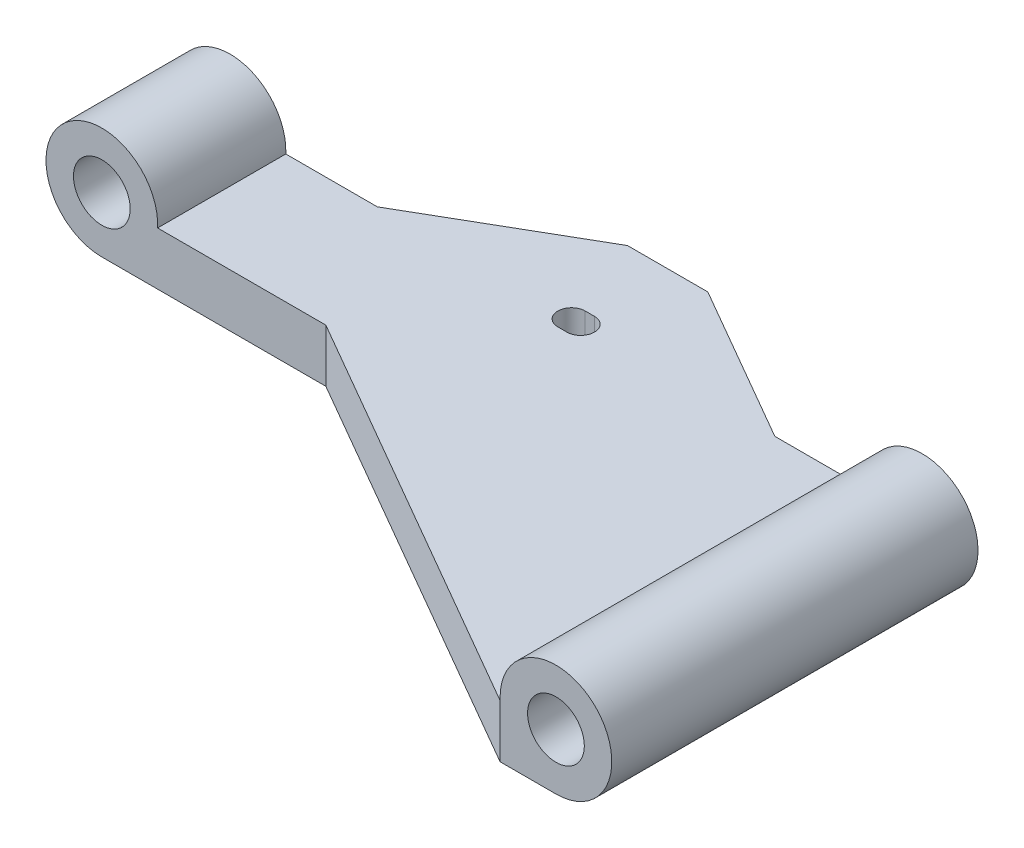
ISO-10303-21;
HEADER;
FILE_DESCRIPTION(('STEP AP214'),'2;1');
FILE_NAME('part.step','',(''),(''),'','','');
FILE_SCHEMA(('AUTOMOTIVE_DESIGN { 1 0 10303 214 1 1 1 1 }'));
ENDSEC;
DATA;
#1=APPLICATION_CONTEXT('core data for automotive mechanical design processes');
#2=APPLICATION_PROTOCOL_DEFINITION('international standard','automotive_design',2000,#1);
#3=PRODUCT_CONTEXT('',#1,'mechanical');
#4=PRODUCT('Part','Part','',(#3));
#5=PRODUCT_RELATED_PRODUCT_CATEGORY('part','',(#4));
#6=PRODUCT_DEFINITION_FORMATION('','',#4);
#7=PRODUCT_DEFINITION_CONTEXT('part definition',#1,'design');
#8=PRODUCT_DEFINITION('design','',#6,#7);
#9=PRODUCT_DEFINITION_SHAPE('','',#8);
#10=(LENGTH_UNIT() NAMED_UNIT(*) SI_UNIT(.MILLI.,.METRE.));
#11=(NAMED_UNIT(*) PLANE_ANGLE_UNIT() SI_UNIT($,.RADIAN.));
#12=(NAMED_UNIT(*) SI_UNIT($,.STERADIAN.) SOLID_ANGLE_UNIT());
#13=UNCERTAINTY_MEASURE_WITH_UNIT(LENGTH_MEASURE(1.E-05),#10,'distance_accuracy_value','');
#14=(GEOMETRIC_REPRESENTATION_CONTEXT(3) GLOBAL_UNCERTAINTY_ASSIGNED_CONTEXT((#13)) GLOBAL_UNIT_ASSIGNED_CONTEXT((#10,
#11,#12)) REPRESENTATION_CONTEXT('',''));
#15=CARTESIAN_POINT('',(0.,0.,0.));
#16=DIRECTION('',(0.,0.,1.));
#17=DIRECTION('',(1.,0.,0.));
#18=AXIS2_PLACEMENT_3D('',#15,#16,#17);
#19=CARTESIAN_POINT('',(-18.9,15.755,45.));
#20=DIRECTION('',(0.,0.,1.));
#21=DIRECTION('',(1.,0.,0.));
#22=AXIS2_PLACEMENT_3D('',#19,#20,#21);
#23=CYLINDRICAL_SURFACE('',#22,3.05000000000001);
#24=DIRECTION('',(0.,0.,1.));
#25=VECTOR('',#24,1.);
#26=CARTESIAN_POINT('',(-15.8539410708261,15.6,45.));
#27=LINE('',#26,#25);
#28=CARTESIAN_POINT('',(-15.8539410708261,15.6,50.));
#29=VERTEX_POINT('',#28);
#30=CARTESIAN_POINT('',(-15.8539410708261,15.6,57.));
#31=VERTEX_POINT('',#30);
#32=EDGE_CURVE('E48',#29,#31,#27,.T.);
#33=ORIENTED_EDGE('',*,*,#32,.F.);
#34=CARTESIAN_POINT('',(-18.9,15.755,50.));
#35=DIRECTION('',(0.,0.,-1.));
#36=DIRECTION('',(-1.,0.,0.));
#37=AXIS2_PLACEMENT_3D('',#34,#35,#36);
#38=CIRCLE('',#37,3.05000000000001);
#39=CARTESIAN_POINT('',(-18.9,12.705,50.));
#40=VERTEX_POINT('',#39);
#41=EDGE_CURVE('E210',#29,#40,#38,.F.);
#42=ORIENTED_EDGE('',*,*,#41,.T.);
#43=DIRECTION('',(0.,0.,1.));
#44=VECTOR('',#43,1.);
#45=CARTESIAN_POINT('',(-18.9,12.705,45.));
#46=LINE('',#45,#44);
#47=CARTESIAN_POINT('',(-18.9,12.705,57.));
#48=VERTEX_POINT('',#47);
#49=EDGE_CURVE('E251',#40,#48,#46,.T.);
#50=ORIENTED_EDGE('',*,*,#49,.T.);
#51=CARTESIAN_POINT('',(-18.9,15.755,57.));
#52=DIRECTION('',(0.,0.,-1.));
#53=DIRECTION('',(-1.,0.,0.));
#54=AXIS2_PLACEMENT_3D('',#51,#52,#53);
#55=CIRCLE('',#54,3.05000000000001);
#56=EDGE_CURVE('E161',#31,#48,#55,.F.);
#57=ORIENTED_EDGE('',*,*,#56,.F.);
#58=EDGE_LOOP('',(#33,#42,#50,#57));
#59=FACE_BOUND('',#58,.T.);
#60=ADVANCED_FACE('F39',(#59),#23,.T.);
#61=CARTESIAN_POINT('',(0.249999999999998,12.705,50.));
#62=DIRECTION('',(0.,1.,0.));
#63=DIRECTION('',(-1.,0.,0.));
#64=AXIS2_PLACEMENT_3D('',#61,#62,#63);
#65=CYLINDRICAL_SURFACE('',#64,0.750000000000001);
#66=CARTESIAN_POINT('',(0.249999999999998,13.505,50.));
#67=DIRECTION('',(0.,-1.,0.));
#68=DIRECTION('',(1.,0.,0.));
#69=AXIS2_PLACEMENT_3D('',#66,#67,#68);
#70=CIRCLE('',#69,0.750000000000001);
#71=CARTESIAN_POINT('',(0.249999999999998,13.505,50.75));
#72=VERTEX_POINT('',#71);
#73=CARTESIAN_POINT('',(0.249999999999998,13.505,49.25));
#74=VERTEX_POINT('',#73);
#75=EDGE_CURVE('E222',#72,#74,#70,.F.);
#76=ORIENTED_EDGE('',*,*,#75,.F.);
#77=DIRECTION('',(0.,1.,0.));
#78=VECTOR('',#77,1.);
#79=CARTESIAN_POINT('',(0.249999999999998,12.705,50.75));
#80=LINE('',#79,#78);
#81=CARTESIAN_POINT('',(0.249999999999998,15.6,50.75));
#82=VERTEX_POINT('',#81);
#83=EDGE_CURVE('E237',#72,#82,#80,.T.);
#84=ORIENTED_EDGE('',*,*,#83,.T.);
#85=CARTESIAN_POINT('',(0.249999999999998,15.6,50.));
#86=DIRECTION('',(0.,1.,0.));
#87=DIRECTION('',(-1.,0.,0.));
#88=AXIS2_PLACEMENT_3D('',#85,#86,#87);
#89=CIRCLE('',#88,0.750000000000001);
#90=CARTESIAN_POINT('',(0.249999999999998,15.6,49.25));
#91=VERTEX_POINT('',#90);
#92=EDGE_CURVE('E224',#82,#91,#89,.T.);
#93=ORIENTED_EDGE('',*,*,#92,.T.);
#94=DIRECTION('',(0.,1.,0.));
#95=VECTOR('',#94,1.);
#96=CARTESIAN_POINT('',(0.249999999999998,12.705,49.25));
#97=LINE('',#96,#95);
#98=EDGE_CURVE('E236',#74,#91,#97,.T.);
#99=ORIENTED_EDGE('',*,*,#98,.F.);
#100=EDGE_LOOP('',(#76,#84,#93,#99));
#101=FACE_BOUND('',#100,.T.);
#102=ADVANCED_FACE('F287',(#101),#65,.F.);
#103=CARTESIAN_POINT('',(0.249999999999998,12.705,50.75));
#104=DIRECTION('',(0.,0.,1.));
#105=DIRECTION('',(1.,0.,0.));
#106=AXIS2_PLACEMENT_3D('',#103,#104,#105);
#107=PLANE('',#106);
#108=DIRECTION('',(1.,0.,0.));
#109=VECTOR('',#108,1.);
#110=CARTESIAN_POINT('',(0.249999999999998,13.505,50.75));
#111=LINE('',#110,#109);
#112=CARTESIAN_POINT('',(-0.250000000000002,13.505,50.75));
#113=VERTEX_POINT('',#112);
#114=EDGE_CURVE('E220',#113,#72,#111,.T.);
#115=ORIENTED_EDGE('',*,*,#114,.F.);
#116=DIRECTION('',(0.,1.,0.));
#117=VECTOR('',#116,1.);
#118=CARTESIAN_POINT('',(-0.250000000000002,12.705,50.75));
#119=LINE('',#118,#117);
#120=CARTESIAN_POINT('',(-0.250000000000002,15.6,50.75));
#121=VERTEX_POINT('',#120);
#122=EDGE_CURVE('E239',#113,#121,#119,.T.);
#123=ORIENTED_EDGE('',*,*,#122,.T.);
#124=DIRECTION('',(1.,0.,0.));
#125=VECTOR('',#124,1.);
#126=CARTESIAN_POINT('',(0.249999999999998,15.6,50.75));
#127=LINE('',#126,#125);
#128=EDGE_CURVE('E233',#121,#82,#127,.T.);
#129=ORIENTED_EDGE('',*,*,#128,.T.);
#130=ORIENTED_EDGE('',*,*,#83,.F.);
#131=EDGE_LOOP('',(#115,#123,#129,#130));
#132=FACE_BOUND('',#131,.T.);
#133=ADVANCED_FACE('F292',(#132),#107,.F.);
#134=CARTESIAN_POINT('',(-0.250000000000002,12.705,50.));
#135=DIRECTION('',(0.,1.,0.));
#136=DIRECTION('',(-1.,0.,0.));
#137=AXIS2_PLACEMENT_3D('',#134,#135,#136);
#138=CYLINDRICAL_SURFACE('',#137,0.750000000000001);
#139=CARTESIAN_POINT('',(-0.250000000000002,13.505,50.));
#140=DIRECTION('',(0.,-1.,0.));
#141=DIRECTION('',(1.,0.,0.));
#142=AXIS2_PLACEMENT_3D('',#139,#140,#141);
#143=CIRCLE('',#142,0.750000000000001);
#144=CARTESIAN_POINT('',(-0.250000000000002,13.505,49.25));
#145=VERTEX_POINT('',#144);
#146=EDGE_CURVE('E216',#145,#113,#143,.F.);
#147=ORIENTED_EDGE('',*,*,#146,.F.);
#148=DIRECTION('',(0.,1.,0.));
#149=VECTOR('',#148,1.);
#150=CARTESIAN_POINT('',(-0.250000000000002,12.705,49.25));
#151=LINE('',#150,#149);
#152=CARTESIAN_POINT('',(-0.250000000000002,15.6,49.25));
#153=VERTEX_POINT('',#152);
#154=EDGE_CURVE('E241',#145,#153,#151,.T.);
#155=ORIENTED_EDGE('',*,*,#154,.T.);
#156=CARTESIAN_POINT('',(-0.250000000000002,15.6,50.));
#157=DIRECTION('',(0.,1.,0.));
#158=DIRECTION('',(-1.,0.,0.));
#159=AXIS2_PLACEMENT_3D('',#156,#157,#158);
#160=CIRCLE('',#159,0.750000000000001);
#161=EDGE_CURVE('E230',#153,#121,#160,.T.);
#162=ORIENTED_EDGE('',*,*,#161,.T.);
#163=ORIENTED_EDGE('',*,*,#122,.F.);
#164=EDGE_LOOP('',(#147,#155,#162,#163));
#165=FACE_BOUND('',#164,.T.);
#166=ADVANCED_FACE('F322',(#165),#138,.F.);
#167=CARTESIAN_POINT('',(0.249999999999998,12.705,49.25));
#168=DIRECTION('',(0.,0.,-1.));
#169=DIRECTION('',(-1.,0.,0.));
#170=AXIS2_PLACEMENT_3D('',#167,#168,#169);
#171=PLANE('',#170);
#172=DIRECTION('',(-1.,0.,0.));
#173=VECTOR('',#172,1.);
#174=CARTESIAN_POINT('',(0.249999999999998,13.505,49.25));
#175=LINE('',#174,#173);
#176=EDGE_CURVE('E11',#74,#145,#175,.T.);
#177=ORIENTED_EDGE('',*,*,#176,.F.);
#178=ORIENTED_EDGE('',*,*,#98,.T.);
#179=DIRECTION('',(-1.,0.,0.));
#180=VECTOR('',#179,1.);
#181=CARTESIAN_POINT('',(0.249999999999998,15.6,49.25));
#182=LINE('',#181,#180);
#183=EDGE_CURVE('E227',#91,#153,#182,.T.);
#184=ORIENTED_EDGE('',*,*,#183,.T.);
#185=ORIENTED_EDGE('',*,*,#154,.F.);
#186=EDGE_LOOP('',(#177,#178,#184,#185));
#187=FACE_BOUND('',#186,.T.);
#188=ADVANCED_FACE('F307',(#187),#171,.F.);
#189=CARTESIAN_POINT('',(0.,15.6,45.));
#190=DIRECTION('',(0.,1.,0.));
#191=DIRECTION('',(-1.,0.,0.));
#192=AXIS2_PLACEMENT_3D('',#189,#190,#191);
#193=PLANE('',#192);
#194=DIRECTION('',(0.866025403784441,0.,-0.499999999999995));
#195=VECTOR('',#194,1.);
#196=CARTESIAN_POINT('',(-0.548421758245391,15.6,44.0501056507427));
#197=LINE('',#196,#195);
#198=CARTESIAN_POINT('',(-10.8539410708261,15.6,50.));
#199=VERTEX_POINT('',#198);
#200=CARTESIAN_POINT('',(-2.1936870329816,15.6,45.));
#201=VERTEX_POINT('',#200);
#202=EDGE_CURVE('E64',#199,#201,#197,.T.);
#203=ORIENTED_EDGE('',*,*,#202,.F.);
#204=DIRECTION('',(-1.,0.,0.));
#205=VECTOR('',#204,1.);
#206=CARTESIAN_POINT('',(0.,15.6,50.));
#207=LINE('',#206,#205);
#208=EDGE_CURVE('E207',#199,#29,#207,.T.);
#209=ORIENTED_EDGE('',*,*,#208,.T.);
#210=ORIENTED_EDGE('',*,*,#32,.T.);
#211=DIRECTION('',(-1.,0.,0.));
#212=VECTOR('',#211,1.);
#213=CARTESIAN_POINT('',(0.,15.6,57.));
#214=LINE('',#213,#212);
#215=CARTESIAN_POINT('',(-6.66666049839574,15.6,57.));
#216=VERTEX_POINT('',#215);
#217=EDGE_CURVE('E204',#216,#31,#214,.T.);
#218=ORIENTED_EDGE('',*,*,#217,.F.);
#219=DIRECTION('',(-0.866025403784442,0.,-0.499999999999995));
#220=VECTOR('',#219,1.);
#221=CARTESIAN_POINT('',(-6.8628175473055,15.6,56.8867486750085));
#222=LINE('',#221,#220);
#223=CARTESIAN_POINT('',(15.85,15.6,70.));
#224=VERTEX_POINT('',#223);
#225=EDGE_CURVE('E151',#224,#216,#222,.T.);
#226=ORIENTED_EDGE('',*,*,#225,.F.);
#227=DIRECTION('',(-1.,0.,0.));
#228=VECTOR('',#227,1.);
#229=CARTESIAN_POINT('',(0.,15.6,70.));
#230=LINE('',#229,#228);
#231=CARTESIAN_POINT('',(15.8539410708261,15.6,70.));
#232=VERTEX_POINT('',#231);
#233=EDGE_CURVE('E257',#232,#224,#230,.T.);
#234=ORIENTED_EDGE('',*,*,#233,.F.);
#235=DIRECTION('',(0.,0.,1.));
#236=VECTOR('',#235,1.);
#237=CARTESIAN_POINT('',(15.8539410708261,15.6,45.));
#238=LINE('',#237,#236);
#239=CARTESIAN_POINT('',(15.8539410708261,15.6,50.));
#240=VERTEX_POINT('',#239);
#241=EDGE_CURVE('E264',#240,#232,#238,.T.);
#242=ORIENTED_EDGE('',*,*,#241,.F.);
#243=DIRECTION('',(1.,0.,0.));
#244=VECTOR('',#243,1.);
#245=CARTESIAN_POINT('',(0.,15.6,50.));
#246=LINE('',#245,#244);
#247=CARTESIAN_POINT('',(10.8539410708261,15.6,50.));
#248=VERTEX_POINT('',#247);
#249=EDGE_CURVE('E200',#248,#240,#246,.T.);
#250=ORIENTED_EDGE('',*,*,#249,.F.);
#251=DIRECTION('',(0.866025403784442,0.,0.499999999999995));
#252=VECTOR('',#251,1.);
#253=CARTESIAN_POINT('',(0.548421758245386,15.6,44.0501056507427));
#254=LINE('',#253,#252);
#255=CARTESIAN_POINT('',(2.1936870329816,15.6,45.));
#256=VERTEX_POINT('',#255);
#257=EDGE_CURVE('E194',#256,#248,#254,.T.);
#258=ORIENTED_EDGE('',*,*,#257,.F.);
#259=DIRECTION('',(-1.,0.,0.));
#260=VECTOR('',#259,1.);
#261=CARTESIAN_POINT('',(0.,15.6,45.));
#262=LINE('',#261,#260);
#263=EDGE_CURVE('E247',#256,#201,#262,.T.);
#264=ORIENTED_EDGE('',*,*,#263,.T.);
#265=EDGE_LOOP('',(#203,#209,#210,#218,#226,#234,#242,#250,#258,#264));
#266=FACE_BOUND('',#265,.T.);
#267=ORIENTED_EDGE('',*,*,#92,.F.);
#268=ORIENTED_EDGE('',*,*,#128,.F.);
#269=ORIENTED_EDGE('',*,*,#161,.F.);
#270=ORIENTED_EDGE('',*,*,#183,.F.);
#271=EDGE_LOOP('',(#267,#268,#269,#270));
#272=FACE_BOUND('',#271,.T.);
#273=ADVANCED_FACE('F303',(#266,#272),#193,.T.);
#274=CARTESIAN_POINT('',(18.9,15.755,45.));
#275=DIRECTION('',(0.,0.,1.));
#276=DIRECTION('',(1.,0.,0.));
#277=AXIS2_PLACEMENT_3D('',#274,#275,#276);
#278=CYLINDRICAL_SURFACE('',#277,3.05000000000001);
#279=CARTESIAN_POINT('',(18.9,15.755,50.));
#280=DIRECTION('',(0.,0.,1.));
#281=DIRECTION('',(1.,0.,0.));
#282=AXIS2_PLACEMENT_3D('',#279,#280,#281);
#283=CIRCLE('',#282,3.05000000000001);
#284=CARTESIAN_POINT('',(18.9,12.705,50.));
#285=VERTEX_POINT('',#284);
#286=EDGE_CURVE('E198',#285,#240,#283,.T.);
#287=ORIENTED_EDGE('',*,*,#286,.T.);
#288=ORIENTED_EDGE('',*,*,#241,.T.);
#289=CARTESIAN_POINT('',(18.9,15.755,70.));
#290=DIRECTION('',(0.,0.,1.));
#291=DIRECTION('',(1.,0.,0.));
#292=AXIS2_PLACEMENT_3D('',#289,#290,#291);
#293=CIRCLE('',#292,3.05000000000001);
#294=CARTESIAN_POINT('',(15.85,15.755,70.));
#295=VERTEX_POINT('',#294);
#296=EDGE_CURVE('E254',#232,#295,#293,.F.);
#297=ORIENTED_EDGE('',*,*,#296,.T.);
#298=CARTESIAN_POINT('',(18.9,12.705,70.));
#299=VERTEX_POINT('',#298);
#300=EDGE_CURVE('E253',#295,#299,#293,.F.);
#301=ORIENTED_EDGE('',*,*,#300,.T.);
#302=DIRECTION('',(0.,0.,1.));
#303=VECTOR('',#302,1.);
#304=CARTESIAN_POINT('',(18.9,12.705,45.));
#305=LINE('',#304,#303);
#306=EDGE_CURVE('E266',#285,#299,#305,.T.);
#307=ORIENTED_EDGE('',*,*,#306,.F.);
#308=EDGE_LOOP('',(#287,#288,#297,#301,#307));
#309=FACE_BOUND('',#308,.T.);
#310=ADVANCED_FACE('F300',(#309),#278,.T.);
#311=CARTESIAN_POINT('',(0.,12.705,45.));
#312=DIRECTION('',(0.,-1.,0.));
#313=DIRECTION('',(1.,0.,0.));
#314=AXIS2_PLACEMENT_3D('',#311,#312,#313);
#315=PLANE('',#314);
#316=DIRECTION('',(0.866025403784441,0.,-0.499999999999996));
#317=VECTOR('',#316,1.);
#318=CARTESIAN_POINT('',(18.9371498269044,12.705,32.8001056507429));
#319=LINE('',#318,#317);
#320=CARTESIAN_POINT('',(-10.8539410708261,12.705,50.));
#321=VERTEX_POINT('',#320);
#322=CARTESIAN_POINT('',(-2.19368703298162,12.705,45.));
#323=VERTEX_POINT('',#322);
#324=EDGE_CURVE('E182',#321,#323,#319,.T.);
#325=ORIENTED_EDGE('',*,*,#324,.T.);
#326=DIRECTION('',(1.,0.,0.));
#327=VECTOR('',#326,1.);
#328=CARTESIAN_POINT('',(0.,12.705,45.));
#329=LINE('',#328,#327);
#330=CARTESIAN_POINT('',(2.1936870329816,12.705,45.));
#331=VERTEX_POINT('',#330);
#332=EDGE_CURVE('E244',#323,#331,#329,.T.);
#333=ORIENTED_EDGE('',*,*,#332,.T.);
#334=DIRECTION('',(0.866025403784442,0.,0.499999999999995));
#335=VECTOR('',#334,1.);
#336=CARTESIAN_POINT('',(-18.9371498269043,12.705,32.800105650743));
#337=LINE('',#336,#335);
#338=CARTESIAN_POINT('',(10.8539410708261,12.705,50.));
#339=VERTEX_POINT('',#338);
#340=EDGE_CURVE('E56',#331,#339,#337,.T.);
#341=ORIENTED_EDGE('',*,*,#340,.T.);
#342=DIRECTION('',(1.,0.,0.));
#343=VECTOR('',#342,1.);
#344=CARTESIAN_POINT('',(0.,12.705,50.));
#345=LINE('',#344,#343);
#346=EDGE_CURVE('E177',#339,#285,#345,.T.);
#347=ORIENTED_EDGE('',*,*,#346,.T.);
#348=ORIENTED_EDGE('',*,*,#306,.T.);
#349=DIRECTION('',(1.,0.,0.));
#350=VECTOR('',#349,1.);
#351=CARTESIAN_POINT('',(0.,12.705,70.));
#352=LINE('',#351,#350);
#353=CARTESIAN_POINT('',(15.85,12.705,70.));
#354=VERTEX_POINT('',#353);
#355=EDGE_CURVE('E171',#354,#299,#352,.T.);
#356=ORIENTED_EDGE('',*,*,#355,.F.);
#357=DIRECTION('',(-0.866025403784442,0.,-0.499999999999995));
#358=VECTOR('',#357,1.);
#359=CARTESIAN_POINT('',(-26.3483891324552,12.705,45.6367486750088));
#360=LINE('',#359,#358);
#361=CARTESIAN_POINT('',(-6.66666049839574,12.705,57.));
#362=VERTEX_POINT('',#361);
#363=EDGE_CURVE('E148',#354,#362,#360,.T.);
#364=ORIENTED_EDGE('',*,*,#363,.T.);
#365=DIRECTION('',(-1.,0.,0.));
#366=VECTOR('',#365,1.);
#367=CARTESIAN_POINT('',(0.,12.705,57.));
#368=LINE('',#367,#366);
#369=EDGE_CURVE('E156',#362,#48,#368,.T.);
#370=ORIENTED_EDGE('',*,*,#369,.T.);
#371=ORIENTED_EDGE('',*,*,#49,.F.);
#372=DIRECTION('',(-1.,0.,0.));
#373=VECTOR('',#372,1.);
#374=CARTESIAN_POINT('',(0.,12.705,50.));
#375=LINE('',#374,#373);
#376=EDGE_CURVE('E179',#321,#40,#375,.T.);
#377=ORIENTED_EDGE('',*,*,#376,.F.);
#378=EDGE_LOOP('',(#325,#333,#341,#347,#348,#356,#364,#370,#371,#377));
#379=FACE_BOUND('',#378,.T.);
#380=CARTESIAN_POINT('',(-3.44490879191414E-13,12.705,49.9999999999999));
#381=DIRECTION('',(0.,-1.,0.));
#382=DIRECTION('',(1.,0.,0.));
#383=AXIS2_PLACEMENT_3D('',#380,#381,#382);
#384=CIRCLE('',#383,1.6);
#385=CARTESIAN_POINT('',(1.59999999999965,12.705,49.9999999999999));
#386=VERTEX_POINT('',#385);
#387=EDGE_CURVE('E212',#386,#386,#384,.T.);
#388=ORIENTED_EDGE('',*,*,#387,.F.);
#389=EDGE_LOOP('',(#388));
#390=FACE_BOUND('',#389,.T.);
#391=ADVANCED_FACE('F168',(#379,#390),#315,.T.);
#392=CARTESIAN_POINT('',(18.9,15.755,45.));
#393=DIRECTION('',(0.,0.,1.));
#394=DIRECTION('',(1.,0.,0.));
#395=AXIS2_PLACEMENT_3D('',#392,#393,#394);
#396=CYLINDRICAL_SURFACE('',#395,1.55);
#397=CARTESIAN_POINT('',(18.9,15.755,50.));
#398=DIRECTION('',(0.,0.,1.));
#399=DIRECTION('',(1.,0.,0.));
#400=AXIS2_PLACEMENT_3D('',#397,#398,#399);
#401=CIRCLE('',#400,1.55);
#402=CARTESIAN_POINT('',(20.45,15.755,50.));
#403=VERTEX_POINT('',#402);
#404=EDGE_CURVE('E197',#403,#403,#401,.T.);
#405=ORIENTED_EDGE('',*,*,#404,.F.);
#406=EDGE_LOOP('',(#405));
#407=FACE_BOUND('',#406,.T.);
#408=CARTESIAN_POINT('',(18.9,15.755,70.));
#409=DIRECTION('',(0.,0.,1.));
#410=DIRECTION('',(1.,0.,0.));
#411=AXIS2_PLACEMENT_3D('',#408,#409,#410);
#412=CIRCLE('',#411,1.55);
#413=CARTESIAN_POINT('',(20.45,15.755,70.));
#414=VERTEX_POINT('',#413);
#415=EDGE_CURVE('E248',#414,#414,#412,.F.);
#416=ORIENTED_EDGE('',*,*,#415,.F.);
#417=EDGE_LOOP('',(#416));
#418=FACE_BOUND('',#417,.T.);
#419=ADVANCED_FACE('F299',(#407,#418),#396,.F.);
#420=CARTESIAN_POINT('',(0.,0.,45.));
#421=DIRECTION('',(0.,0.,1.));
#422=DIRECTION('',(1.,0.,0.));
#423=AXIS2_PLACEMENT_3D('',#420,#421,#422);
#424=PLANE('',#423);
#425=ORIENTED_EDGE('',*,*,#332,.F.);
#426=DIRECTION('',(0.,1.,0.));
#427=VECTOR('',#426,1.);
#428=CARTESIAN_POINT('',(-2.19368703298162,12.705,45.));
#429=LINE('',#428,#427);
#430=EDGE_CURVE('E172',#323,#201,#429,.T.);
#431=ORIENTED_EDGE('',*,*,#430,.T.);
#432=ORIENTED_EDGE('',*,*,#263,.F.);
#433=DIRECTION('',(0.,1.,0.));
#434=VECTOR('',#433,1.);
#435=CARTESIAN_POINT('',(2.1936870329816,12.705,45.));
#436=LINE('',#435,#434);
#437=EDGE_CURVE('E188',#331,#256,#436,.T.);
#438=ORIENTED_EDGE('',*,*,#437,.F.);
#439=EDGE_LOOP('',(#425,#431,#432,#438));
#440=FACE_BOUND('',#439,.T.);
#441=ADVANCED_FACE('F311',(#440),#424,.F.);
#442=CARTESIAN_POINT('',(0.,0.,70.));
#443=DIRECTION('',(0.,0.,1.));
#444=DIRECTION('',(1.,0.,0.));
#445=AXIS2_PLACEMENT_3D('',#442,#443,#444);
#446=PLANE('',#445);
#447=DIRECTION('',(0.,1.,0.));
#448=VECTOR('',#447,1.);
#449=CARTESIAN_POINT('',(15.85,12.705,70.));
#450=LINE('',#449,#448);
#451=EDGE_CURVE('E155',#354,#224,#450,.T.);
#452=ORIENTED_EDGE('',*,*,#451,.F.);
#453=ORIENTED_EDGE('',*,*,#355,.T.);
#454=ORIENTED_EDGE('',*,*,#300,.F.);
#455=ORIENTED_EDGE('',*,*,#296,.F.);
#456=ORIENTED_EDGE('',*,*,#233,.T.);
#457=EDGE_LOOP('',(#452,#453,#454,#455,#456));
#458=FACE_BOUND('',#457,.T.);
#459=ORIENTED_EDGE('',*,*,#415,.T.);
#460=EDGE_LOOP('',(#459));
#461=FACE_BOUND('',#460,.T.);
#462=ADVANCED_FACE('F313',(#458,#461),#446,.T.);
#463=CARTESIAN_POINT('',(-3.44601020364492E-13,13.505,49.9999999999999));
#464=DIRECTION('',(0.,-1.,0.));
#465=DIRECTION('',(1.,0.,0.));
#466=AXIS2_PLACEMENT_3D('',#463,#464,#465);
#467=PLANE('',#466);
#468=CARTESIAN_POINT('',(-3.44601020364492E-13,13.505,49.9999999999999));
#469=DIRECTION('',(0.,-1.,0.));
#470=DIRECTION('',(1.,0.,0.));
#471=AXIS2_PLACEMENT_3D('',#468,#469,#470);
#472=CIRCLE('',#471,1.6);
#473=CARTESIAN_POINT('',(1.59999999999965,13.505,49.9999999999999));
#474=VERTEX_POINT('',#473);
#475=EDGE_CURVE('E213',#474,#474,#472,.T.);
#476=ORIENTED_EDGE('',*,*,#475,.T.);
#477=EDGE_LOOP('',(#476));
#478=FACE_BOUND('',#477,.T.);
#479=ORIENTED_EDGE('',*,*,#75,.T.);
#480=ORIENTED_EDGE('',*,*,#176,.T.);
#481=ORIENTED_EDGE('',*,*,#146,.T.);
#482=ORIENTED_EDGE('',*,*,#114,.T.);
#483=EDGE_LOOP('',(#479,#480,#481,#482));
#484=FACE_BOUND('',#483,.T.);
#485=ADVANCED_FACE('F283',(#478,#484),#467,.T.);
#486=CARTESIAN_POINT('',(-3.44601020364492E-13,13.505,49.9999999999999));
#487=DIRECTION('',(0.,-1.,0.));
#488=DIRECTION('',(1.,0.,0.));
#489=AXIS2_PLACEMENT_3D('',#486,#487,#488);
#490=CYLINDRICAL_SURFACE('',#489,1.6);
#491=ORIENTED_EDGE('',*,*,#475,.F.);
#492=EDGE_LOOP('',(#491));
#493=FACE_BOUND('',#492,.T.);
#494=ORIENTED_EDGE('',*,*,#387,.T.);
#495=EDGE_LOOP('',(#494));
#496=FACE_BOUND('',#495,.T.);
#497=ADVANCED_FACE('F275',(#493,#496),#490,.F.);
#498=CARTESIAN_POINT('',(0.,12.705,57.));
#499=DIRECTION('',(0.,0.,-1.));
#500=DIRECTION('',(-1.,0.,0.));
#501=AXIS2_PLACEMENT_3D('',#498,#499,#500);
#502=PLANE('',#501);
#503=ORIENTED_EDGE('',*,*,#56,.T.);
#504=ORIENTED_EDGE('',*,*,#369,.F.);
#505=DIRECTION('',(0.,1.,0.));
#506=VECTOR('',#505,1.);
#507=CARTESIAN_POINT('',(-6.66666049839574,12.705,57.));
#508=LINE('',#507,#506);
#509=EDGE_CURVE('E144',#362,#216,#508,.T.);
#510=ORIENTED_EDGE('',*,*,#509,.T.);
#511=ORIENTED_EDGE('',*,*,#217,.T.);
#512=EDGE_LOOP('',(#503,#504,#510,#511));
#513=FACE_BOUND('',#512,.T.);
#514=CARTESIAN_POINT('',(-18.9,15.755,57.));
#515=DIRECTION('',(0.,0.,-1.));
#516=DIRECTION('',(-1.,0.,0.));
#517=AXIS2_PLACEMENT_3D('',#514,#515,#516);
#518=CIRCLE('',#517,1.55);
#519=CARTESIAN_POINT('',(-17.35,15.755,57.));
#520=VERTEX_POINT('',#519);
#521=EDGE_CURVE('E203',#520,#520,#518,.F.);
#522=ORIENTED_EDGE('',*,*,#521,.F.);
#523=EDGE_LOOP('',(#522));
#524=FACE_BOUND('',#523,.T.);
#525=ADVANCED_FACE('F159',(#513,#524),#502,.F.);
#526=CARTESIAN_POINT('',(-26.3483891324552,12.705,45.6367486750088));
#527=DIRECTION('',(0.499999999999995,0.,-0.866025403784442));
#528=DIRECTION('',(-0.866025403784442,0.,-0.499999999999995));
#529=AXIS2_PLACEMENT_3D('',#526,#527,#528);
#530=PLANE('',#529);
#531=ORIENTED_EDGE('',*,*,#225,.T.);
#532=ORIENTED_EDGE('',*,*,#509,.F.);
#533=ORIENTED_EDGE('',*,*,#363,.F.);
#534=ORIENTED_EDGE('',*,*,#451,.T.);
#535=EDGE_LOOP('',(#531,#532,#533,#534));
#536=FACE_BOUND('',#535,.T.);
#537=ADVANCED_FACE('F146',(#536),#530,.F.);
#538=CARTESIAN_POINT('',(0.,12.705,50.));
#539=DIRECTION('',(0.,0.,1.));
#540=DIRECTION('',(1.,0.,0.));
#541=AXIS2_PLACEMENT_3D('',#538,#539,#540);
#542=PLANE('',#541);
#543=ORIENTED_EDGE('',*,*,#249,.T.);
#544=ORIENTED_EDGE('',*,*,#286,.F.);
#545=ORIENTED_EDGE('',*,*,#346,.F.);
#546=DIRECTION('',(0.,1.,0.));
#547=VECTOR('',#546,1.);
#548=CARTESIAN_POINT('',(10.8539410708261,12.705,50.));
#549=LINE('',#548,#547);
#550=EDGE_CURVE('E189',#339,#248,#549,.T.);
#551=ORIENTED_EDGE('',*,*,#550,.T.);
#552=EDGE_LOOP('',(#543,#544,#545,#551));
#553=FACE_BOUND('',#552,.T.);
#554=ORIENTED_EDGE('',*,*,#404,.T.);
#555=EDGE_LOOP('',(#554));
#556=FACE_BOUND('',#555,.T.);
#557=ADVANCED_FACE('F281',(#553,#556),#542,.F.);
#558=CARTESIAN_POINT('',(-18.9371498269043,12.705,32.800105650743));
#559=DIRECTION('',(-0.499999999999995,0.,0.866025403784442));
#560=DIRECTION('',(0.866025403784442,0.,0.499999999999995));
#561=AXIS2_PLACEMENT_3D('',#558,#559,#560);
#562=PLANE('',#561);
#563=ORIENTED_EDGE('',*,*,#257,.T.);
#564=ORIENTED_EDGE('',*,*,#550,.F.);
#565=ORIENTED_EDGE('',*,*,#340,.F.);
#566=ORIENTED_EDGE('',*,*,#437,.T.);
#567=EDGE_LOOP('',(#563,#564,#565,#566));
#568=FACE_BOUND('',#567,.T.);
#569=ADVANCED_FACE('F335',(#568),#562,.F.);
#570=CARTESIAN_POINT('',(0.,12.705,50.));
#571=DIRECTION('',(0.,0.,-1.));
#572=DIRECTION('',(-1.,0.,0.));
#573=AXIS2_PLACEMENT_3D('',#570,#571,#572);
#574=PLANE('',#573);
#575=ORIENTED_EDGE('',*,*,#41,.F.);
#576=ORIENTED_EDGE('',*,*,#208,.F.);
#577=DIRECTION('',(0.,1.,0.));
#578=VECTOR('',#577,1.);
#579=CARTESIAN_POINT('',(-10.8539410708261,12.705,50.));
#580=LINE('',#579,#578);
#581=EDGE_CURVE('E174',#321,#199,#580,.T.);
#582=ORIENTED_EDGE('',*,*,#581,.F.);
#583=ORIENTED_EDGE('',*,*,#376,.T.);
#584=EDGE_LOOP('',(#575,#576,#582,#583));
#585=FACE_BOUND('',#584,.T.);
#586=CARTESIAN_POINT('',(-18.9,15.755,50.));
#587=DIRECTION('',(0.,0.,-1.));
#588=DIRECTION('',(-1.,0.,0.));
#589=AXIS2_PLACEMENT_3D('',#586,#587,#588);
#590=CIRCLE('',#589,1.55);
#591=CARTESIAN_POINT('',(-17.35,15.755,50.));
#592=VERTEX_POINT('',#591);
#593=EDGE_CURVE('E43',#592,#592,#590,.F.);
#594=ORIENTED_EDGE('',*,*,#593,.T.);
#595=EDGE_LOOP('',(#594));
#596=FACE_BOUND('',#595,.T.);
#597=ADVANCED_FACE('F339',(#585,#596),#574,.T.);
#598=CARTESIAN_POINT('',(18.9371498269044,12.705,32.8001056507429));
#599=DIRECTION('',(0.499999999999995,0.,0.866025403784441));
#600=DIRECTION('',(0.866025403784441,0.,-0.499999999999995));
#601=AXIS2_PLACEMENT_3D('',#598,#599,#600);
#602=PLANE('',#601);
#603=ORIENTED_EDGE('',*,*,#202,.T.);
#604=ORIENTED_EDGE('',*,*,#430,.F.);
#605=ORIENTED_EDGE('',*,*,#324,.F.);
#606=ORIENTED_EDGE('',*,*,#581,.T.);
#607=EDGE_LOOP('',(#603,#604,#605,#606));
#608=FACE_BOUND('',#607,.T.);
#609=ADVANCED_FACE('F342',(#608),#602,.F.);
#610=CARTESIAN_POINT('',(-18.9,15.755,45.));
#611=DIRECTION('',(0.,0.,1.));
#612=DIRECTION('',(1.,0.,0.));
#613=AXIS2_PLACEMENT_3D('',#610,#611,#612);
#614=CYLINDRICAL_SURFACE('',#613,1.55);
#615=CARTESIAN_POINT('',(-17.35,15.755,57.));
#616=CARTESIAN_POINT('',(-17.35,15.755,56.9270833333333));
#617=CARTESIAN_POINT('',(-17.35,15.755,56.8541666666667));
#618=CARTESIAN_POINT('',(-17.35,15.755,56.7083333333333));
#619=CARTESIAN_POINT('',(-17.35,15.755,56.6354166666667));
#620=CARTESIAN_POINT('',(-17.35,15.755,56.4895833333333));
#621=CARTESIAN_POINT('',(-17.35,15.755,56.4166666666667));
#622=CARTESIAN_POINT('',(-17.35,15.755,56.2708333333333));
#623=CARTESIAN_POINT('',(-17.35,15.755,56.1979166666667));
#624=CARTESIAN_POINT('',(-17.35,15.755,56.0520833333333));
#625=CARTESIAN_POINT('',(-17.35,15.755,55.9791666666667));
#626=CARTESIAN_POINT('',(-17.35,15.755,55.8333333333333));
#627=CARTESIAN_POINT('',(-17.35,15.755,55.7604166666667));
#628=CARTESIAN_POINT('',(-17.35,15.755,55.6145833333333));
#629=CARTESIAN_POINT('',(-17.35,15.755,55.5416666666667));
#630=CARTESIAN_POINT('',(-17.35,15.755,55.3958333333333));
#631=CARTESIAN_POINT('',(-17.35,15.755,55.3229166666667));
#632=CARTESIAN_POINT('',(-17.35,15.755,55.1770833333333));
#633=CARTESIAN_POINT('',(-17.35,15.755,55.1041666666667));
#634=CARTESIAN_POINT('',(-17.35,15.755,54.9583333333333));
#635=CARTESIAN_POINT('',(-17.35,15.755,54.8854166666667));
#636=CARTESIAN_POINT('',(-17.35,15.755,54.7395833333333));
#637=CARTESIAN_POINT('',(-17.35,15.755,54.6666666666667));
#638=CARTESIAN_POINT('',(-17.35,15.755,54.5208333333333));
#639=CARTESIAN_POINT('',(-17.35,15.755,54.4479166666667));
#640=CARTESIAN_POINT('',(-17.35,15.755,54.3020833333333));
#641=CARTESIAN_POINT('',(-17.35,15.755,54.2291666666667));
#642=CARTESIAN_POINT('',(-17.35,15.755,54.0833333333333));
#643=CARTESIAN_POINT('',(-17.35,15.755,54.0104166666667));
#644=CARTESIAN_POINT('',(-17.35,15.755,53.8645833333333));
#645=CARTESIAN_POINT('',(-17.35,15.755,53.7916666666667));
#646=CARTESIAN_POINT('',(-17.35,15.755,53.6458333333333));
#647=CARTESIAN_POINT('',(-17.35,15.755,53.5729166666667));
#648=CARTESIAN_POINT('',(-17.35,15.755,53.4270833333333));
#649=CARTESIAN_POINT('',(-17.35,15.755,53.3541666666667));
#650=CARTESIAN_POINT('',(-17.35,15.755,53.2083333333333));
#651=CARTESIAN_POINT('',(-17.35,15.755,53.1354166666667));
#652=CARTESIAN_POINT('',(-17.35,15.755,52.9895833333333));
#653=CARTESIAN_POINT('',(-17.35,15.755,52.9166666666667));
#654=CARTESIAN_POINT('',(-17.35,15.755,52.7708333333333));
#655=CARTESIAN_POINT('',(-17.35,15.755,52.6979166666667));
#656=CARTESIAN_POINT('',(-17.35,15.755,52.5520833333333));
#657=CARTESIAN_POINT('',(-17.35,15.755,52.4791666666667));
#658=CARTESIAN_POINT('',(-17.35,15.755,52.3333333333333));
#659=CARTESIAN_POINT('',(-17.35,15.755,52.2604166666667));
#660=CARTESIAN_POINT('',(-17.35,15.755,52.1145833333333));
#661=CARTESIAN_POINT('',(-17.35,15.755,52.0416666666667));
#662=CARTESIAN_POINT('',(-17.35,15.755,51.8958333333333));
#663=CARTESIAN_POINT('',(-17.35,15.755,51.8229166666667));
#664=CARTESIAN_POINT('',(-17.35,15.755,51.6770833333333));
#665=CARTESIAN_POINT('',(-17.35,15.755,51.6041666666667));
#666=CARTESIAN_POINT('',(-17.35,15.755,51.4583333333333));
#667=CARTESIAN_POINT('',(-17.35,15.755,51.3854166666667));
#668=CARTESIAN_POINT('',(-17.35,15.755,51.2395833333333));
#669=CARTESIAN_POINT('',(-17.35,15.755,51.1666666666667));
#670=CARTESIAN_POINT('',(-17.35,15.755,51.0208333333333));
#671=CARTESIAN_POINT('',(-17.35,15.755,50.9479166666667));
#672=CARTESIAN_POINT('',(-17.35,15.755,50.8020833333333));
#673=CARTESIAN_POINT('',(-17.35,15.755,50.7291666666667));
#674=CARTESIAN_POINT('',(-17.35,15.755,50.5833333333333));
#675=CARTESIAN_POINT('',(-17.35,15.755,50.5104166666667));
#676=CARTESIAN_POINT('',(-17.35,15.755,50.3645833333333));
#677=CARTESIAN_POINT('',(-17.35,15.755,50.2916666666667));
#678=CARTESIAN_POINT('',(-17.35,15.755,50.1458333333333));
#679=CARTESIAN_POINT('',(-17.35,15.755,50.0729166666667));
#680=CARTESIAN_POINT('',(-17.35,15.755,50.));
#681=B_SPLINE_CURVE_WITH_KNOTS('',3,(#615,#616,#617,#618,#619,#620,#621,#622,#623,#624,#625,
#626,#627,#628,#629,#630,#631,#632,#633,#634,#635,#636,#637,#638,#639,#640,#641,#642,#643,#644,
#645,#646,#647,#648,#649,#650,#651,#652,#653,#654,#655,#656,#657,#658,#659,#660,#661,#662,#663,
#664,#665,#666,#667,#668,#669,#670,#671,#672,#673,#674,#675,#676,#677,#678,#679,#680),
.UNSPECIFIED.,.F.,.F.,(4,2,2,2,2,2,2,2,2,2,2,2,2,2,2,2,2,2,2,2,2,2,2,2,2,2,2,2,2,2,2,2,4),(0.,
0.218750000000004,0.437500000000007,0.656250000000004,0.875000000000001,1.09375,1.3125,1.53125,
1.75,1.96875000000001,2.1875,2.40625,2.625,2.84375000000001,3.0625,3.28125,3.5,3.71875000000001,
3.9375,4.15625,4.375,4.59375,4.8125,5.03125,5.25,5.46875,5.68750000000001,5.90625,
6.12500000000001,6.34375,6.5625,6.78125,7.00000000000001),.UNSPECIFIED.);
#682=EDGE_CURVE('BSEAM41',#520,#592,#681,.T.);
#683=ORIENTED_EDGE('',*,*,#521,.T.);
#684=ORIENTED_EDGE('',*,*,#593,.F.);
#685=ORIENTED_EDGE('',*,*,#682,.T.);
#686=ORIENTED_EDGE('',*,*,#682,.F.);
#687=EDGE_LOOP('',(#683,#685,#684,#686));
#688=FACE_BOUND('',#687,.T.);
#689=ADVANCED_FACE('F41',(#688),#614,.F.);
#690=CLOSED_SHELL('',(#60,#102,#133,#166,#188,#273,#310,#391,#419,#441,#462,#485,#497,#525,#537,
#557,#569,#597,#609,#689));
#691=MANIFOLD_SOLID_BREP('B2',#690);
#692=ADVANCED_BREP_SHAPE_REPRESENTATION('',(#18,#691),#14);
#693=SHAPE_DEFINITION_REPRESENTATION(#9,#692);
ENDSEC;
END-ISO-10303-21;
